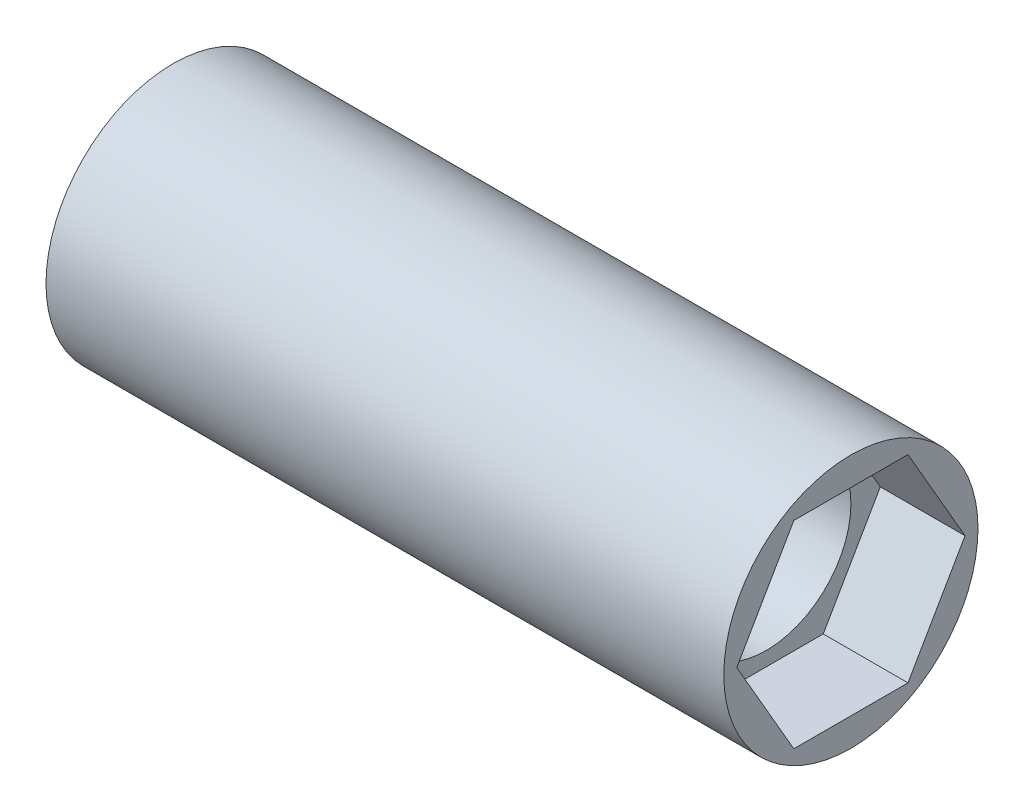
ISO-10303-21;
HEADER;
FILE_DESCRIPTION(('STEP AP214'),'2;1');
FILE_NAME('part.step','',(''),(''),'','','');
FILE_SCHEMA(('AUTOMOTIVE_DESIGN { 1 0 10303 214 1 1 1 1 }'));
ENDSEC;
DATA;
#1=APPLICATION_CONTEXT('core data for automotive mechanical design processes');
#2=APPLICATION_PROTOCOL_DEFINITION('international standard','automotive_design',2000,#1);
#3=PRODUCT_CONTEXT('',#1,'mechanical');
#4=PRODUCT('Part','Part','',(#3));
#5=PRODUCT_RELATED_PRODUCT_CATEGORY('part','',(#4));
#6=PRODUCT_DEFINITION_FORMATION('','',#4);
#7=PRODUCT_DEFINITION_CONTEXT('part definition',#1,'design');
#8=PRODUCT_DEFINITION('design','',#6,#7);
#9=PRODUCT_DEFINITION_SHAPE('','',#8);
#10=(LENGTH_UNIT() NAMED_UNIT(*) SI_UNIT(.MILLI.,.METRE.));
#11=(NAMED_UNIT(*) PLANE_ANGLE_UNIT() SI_UNIT($,.RADIAN.));
#12=(NAMED_UNIT(*) SI_UNIT($,.STERADIAN.) SOLID_ANGLE_UNIT());
#13=UNCERTAINTY_MEASURE_WITH_UNIT(LENGTH_MEASURE(1.E-05),#10,'distance_accuracy_value','');
#14=(GEOMETRIC_REPRESENTATION_CONTEXT(3) GLOBAL_UNCERTAINTY_ASSIGNED_CONTEXT((#13)) GLOBAL_UNIT_ASSIGNED_CONTEXT((#10,
#11,#12)) REPRESENTATION_CONTEXT('',''));
#15=CARTESIAN_POINT('',(0.,0.,0.));
#16=DIRECTION('',(0.,0.,1.));
#17=DIRECTION('',(1.,0.,0.));
#18=AXIS2_PLACEMENT_3D('',#15,#16,#17);
#19=CARTESIAN_POINT('',(24.,0.,0.));
#20=DIRECTION('',(-1.,0.,0.));
#21=DIRECTION('',(0.,0.,1.));
#22=AXIS2_PLACEMENT_3D('',#19,#20,#21);
#23=CYLINDRICAL_SURFACE('',#22,3.);
#24=CARTESIAN_POINT('',(0.,0.,0.));
#25=DIRECTION('',(1.,0.,0.));
#26=DIRECTION('',(0.,0.,-1.));
#27=AXIS2_PLACEMENT_3D('',#24,#25,#26);
#28=CIRCLE('',#27,3.);
#29=CARTESIAN_POINT('',(0.,0.,-3.));
#30=VERTEX_POINT('',#29);
#31=EDGE_CURVE('E146',#30,#30,#28,.T.);
#32=ORIENTED_EDGE('',*,*,#31,.F.);
#33=EDGE_LOOP('',(#32));
#34=FACE_BOUND('',#33,.T.);
#35=CARTESIAN_POINT('',(21.,0.,0.));
#36=DIRECTION('',(1.,0.,0.));
#37=DIRECTION('',(0.,0.,-1.));
#38=AXIS2_PLACEMENT_3D('',#35,#36,#37);
#39=CIRCLE('',#38,3.);
#40=CARTESIAN_POINT('',(21.,0.,-3.));
#41=VERTEX_POINT('',#40);
#42=EDGE_CURVE('E41',#41,#41,#39,.T.);
#43=ORIENTED_EDGE('',*,*,#42,.T.);
#44=EDGE_LOOP('',(#43));
#45=FACE_BOUND('',#44,.T.);
#46=ADVANCED_FACE('F37',(#34,#45),#23,.F.);
#47=CARTESIAN_POINT('',(24.,0.,0.));
#48=DIRECTION('',(1.,0.,0.));
#49=DIRECTION('',(0.,0.,-1.));
#50=AXIS2_PLACEMENT_3D('',#47,#48,#49);
#51=PLANE('',#50);
#52=DIRECTION('',(0.,0.866025403784439,-0.5));
#53=VECTOR('',#52,1.);
#54=CARTESIAN_POINT('',(24.,-3.5,-2.02072594216369));
#55=LINE('',#54,#53);
#56=CARTESIAN_POINT('',(24.,-3.5,-2.02072594216369));
#57=VERTEX_POINT('',#56);
#58=CARTESIAN_POINT('',(24.,0.,-4.04145188432738));
#59=VERTEX_POINT('',#58);
#60=EDGE_CURVE('E54',#57,#59,#55,.T.);
#61=ORIENTED_EDGE('',*,*,#60,.F.);
#62=DIRECTION('',(0.,0.,-1.));
#63=VECTOR('',#62,1.);
#64=CARTESIAN_POINT('',(24.,-3.5,2.02072594216369));
#65=LINE('',#64,#63);
#66=CARTESIAN_POINT('',(24.,-3.5,2.02072594216369));
#67=VERTEX_POINT('',#66);
#68=EDGE_CURVE('E137',#67,#57,#65,.T.);
#69=ORIENTED_EDGE('',*,*,#68,.F.);
#70=DIRECTION('',(0.,-0.866025403784439,-0.5));
#71=VECTOR('',#70,1.);
#72=CARTESIAN_POINT('',(24.,0.,4.04145188432738));
#73=LINE('',#72,#71);
#74=CARTESIAN_POINT('',(24.,0.,4.04145188432738));
#75=VERTEX_POINT('',#74);
#76=EDGE_CURVE('E135',#75,#67,#73,.T.);
#77=ORIENTED_EDGE('',*,*,#76,.F.);
#78=DIRECTION('',(0.,-0.866025403784439,0.5));
#79=VECTOR('',#78,1.);
#80=CARTESIAN_POINT('',(24.,3.5,2.02072594216369));
#81=LINE('',#80,#79);
#82=CARTESIAN_POINT('',(24.,3.5,2.02072594216369));
#83=VERTEX_POINT('',#82);
#84=EDGE_CURVE('E102',#83,#75,#81,.T.);
#85=ORIENTED_EDGE('',*,*,#84,.F.);
#86=DIRECTION('',(0.,0.,1.));
#87=VECTOR('',#86,1.);
#88=CARTESIAN_POINT('',(24.,3.5,-2.02072594216369));
#89=LINE('',#88,#87);
#90=CARTESIAN_POINT('',(24.,3.5,-2.02072594216369));
#91=VERTEX_POINT('',#90);
#92=EDGE_CURVE('E131',#91,#83,#89,.T.);
#93=ORIENTED_EDGE('',*,*,#92,.F.);
#94=DIRECTION('',(0.,0.866025403784439,0.5));
#95=VECTOR('',#94,1.);
#96=CARTESIAN_POINT('',(24.,0.,-4.04145188432738));
#97=LINE('',#96,#95);
#98=EDGE_CURVE('E128',#59,#91,#97,.T.);
#99=ORIENTED_EDGE('',*,*,#98,.F.);
#100=EDGE_LOOP('',(#61,#69,#77,#85,#93,#99));
#101=FACE_BOUND('',#100,.T.);
#102=CARTESIAN_POINT('',(24.,0.,0.));
#103=DIRECTION('',(1.,0.,0.));
#104=DIRECTION('',(0.,0.,-1.));
#105=AXIS2_PLACEMENT_3D('',#102,#103,#104);
#106=CIRCLE('',#105,4.5);
#107=CARTESIAN_POINT('',(24.,0.,-4.5));
#108=VERTEX_POINT('',#107);
#109=EDGE_CURVE('E11',#108,#108,#106,.T.);
#110=ORIENTED_EDGE('',*,*,#109,.T.);
#111=EDGE_LOOP('',(#110));
#112=FACE_BOUND('',#111,.T.);
#113=ADVANCED_FACE('F155',(#101,#112),#51,.T.);
#114=CARTESIAN_POINT('',(0.,0.,0.));
#115=DIRECTION('',(1.,0.,0.));
#116=DIRECTION('',(0.,0.,-1.));
#117=AXIS2_PLACEMENT_3D('',#114,#115,#116);
#118=PLANE('',#117);
#119=CARTESIAN_POINT('',(0.,0.,0.));
#120=DIRECTION('',(1.,0.,0.));
#121=DIRECTION('',(0.,0.,-1.));
#122=AXIS2_PLACEMENT_3D('',#119,#120,#121);
#123=CIRCLE('',#122,4.5);
#124=CARTESIAN_POINT('',(0.,0.,-4.5));
#125=VERTEX_POINT('',#124);
#126=EDGE_CURVE('E46',#125,#125,#123,.T.);
#127=ORIENTED_EDGE('',*,*,#126,.F.);
#128=EDGE_LOOP('',(#127));
#129=FACE_BOUND('',#128,.T.);
#130=ORIENTED_EDGE('',*,*,#31,.T.);
#131=EDGE_LOOP('',(#130));
#132=FACE_BOUND('',#131,.T.);
#133=ADVANCED_FACE('F152',(#129,#132),#118,.F.);
#134=CARTESIAN_POINT('',(24.,0.,0.));
#135=DIRECTION('',(-1.,0.,0.));
#136=DIRECTION('',(0.,0.,1.));
#137=AXIS2_PLACEMENT_3D('',#134,#135,#136);
#138=CYLINDRICAL_SURFACE('',#137,4.5);
#139=ORIENTED_EDGE('',*,*,#109,.F.);
#140=EDGE_LOOP('',(#139));
#141=FACE_BOUND('',#140,.T.);
#142=ORIENTED_EDGE('',*,*,#126,.T.);
#143=EDGE_LOOP('',(#142));
#144=FACE_BOUND('',#143,.T.);
#145=ADVANCED_FACE('F39',(#141,#144),#138,.T.);
#146=CARTESIAN_POINT('',(21.,-3.5,-2.02072594216369));
#147=DIRECTION('',(0.,-0.499999999999999,-0.866025403784439));
#148=DIRECTION('',(0.,0.866025403784439,-0.5));
#149=AXIS2_PLACEMENT_3D('',#146,#147,#148);
#150=PLANE('',#149);
#151=ORIENTED_EDGE('',*,*,#60,.T.);
#152=DIRECTION('',(1.,0.,0.));
#153=VECTOR('',#152,1.);
#154=CARTESIAN_POINT('',(21.,0.,-4.04145188432738));
#155=LINE('',#154,#153);
#156=CARTESIAN_POINT('',(21.,0.,-4.04145188432738));
#157=VERTEX_POINT('',#156);
#158=EDGE_CURVE('E84',#157,#59,#155,.T.);
#159=ORIENTED_EDGE('',*,*,#158,.F.);
#160=DIRECTION('',(0.,0.866025403784439,-0.5));
#161=VECTOR('',#160,1.);
#162=CARTESIAN_POINT('',(21.,-3.5,-2.02072594216369));
#163=LINE('',#162,#161);
#164=CARTESIAN_POINT('',(21.,-3.5,-2.02072594216369));
#165=VERTEX_POINT('',#164);
#166=EDGE_CURVE('E139',#165,#157,#163,.T.);
#167=ORIENTED_EDGE('',*,*,#166,.F.);
#168=DIRECTION('',(1.,0.,0.));
#169=VECTOR('',#168,1.);
#170=CARTESIAN_POINT('',(21.,-3.5,-2.02072594216369));
#171=LINE('',#170,#169);
#172=EDGE_CURVE('E62',#165,#57,#171,.T.);
#173=ORIENTED_EDGE('',*,*,#172,.T.);
#174=EDGE_LOOP('',(#151,#159,#167,#173));
#175=FACE_BOUND('',#174,.T.);
#176=ADVANCED_FACE('F177',(#175),#150,.F.);
#177=CARTESIAN_POINT('',(21.,-3.5,2.02072594216369));
#178=DIRECTION('',(0.,-1.,0.));
#179=DIRECTION('',(0.,0.,-1.));
#180=AXIS2_PLACEMENT_3D('',#177,#178,#179);
#181=PLANE('',#180);
#182=ORIENTED_EDGE('',*,*,#68,.T.);
#183=ORIENTED_EDGE('',*,*,#172,.F.);
#184=DIRECTION('',(0.,0.,-1.));
#185=VECTOR('',#184,1.);
#186=CARTESIAN_POINT('',(21.,-3.5,2.02072594216369));
#187=LINE('',#186,#185);
#188=CARTESIAN_POINT('',(21.,-3.5,2.02072594216369));
#189=VERTEX_POINT('',#188);
#190=EDGE_CURVE('E114',#189,#165,#187,.T.);
#191=ORIENTED_EDGE('',*,*,#190,.F.);
#192=DIRECTION('',(1.,0.,0.));
#193=VECTOR('',#192,1.);
#194=CARTESIAN_POINT('',(21.,-3.5,2.02072594216369));
#195=LINE('',#194,#193);
#196=EDGE_CURVE('E106',#189,#67,#195,.T.);
#197=ORIENTED_EDGE('',*,*,#196,.T.);
#198=EDGE_LOOP('',(#182,#183,#191,#197));
#199=FACE_BOUND('',#198,.T.);
#200=ADVANCED_FACE('F174',(#199),#181,.F.);
#201=CARTESIAN_POINT('',(21.,0.,4.04145188432738));
#202=DIRECTION('',(0.,-0.5,0.866025403784438));
#203=DIRECTION('',(0.,-0.866025403784439,-0.5));
#204=AXIS2_PLACEMENT_3D('',#201,#202,#203);
#205=PLANE('',#204);
#206=ORIENTED_EDGE('',*,*,#76,.T.);
#207=ORIENTED_EDGE('',*,*,#196,.F.);
#208=DIRECTION('',(0.,-0.866025403784439,-0.5));
#209=VECTOR('',#208,1.);
#210=CARTESIAN_POINT('',(21.,0.,4.04145188432738));
#211=LINE('',#210,#209);
#212=CARTESIAN_POINT('',(21.,0.,4.04145188432738));
#213=VERTEX_POINT('',#212);
#214=EDGE_CURVE('E110',#213,#189,#211,.T.);
#215=ORIENTED_EDGE('',*,*,#214,.F.);
#216=DIRECTION('',(1.,0.,0.));
#217=VECTOR('',#216,1.);
#218=CARTESIAN_POINT('',(21.,0.,4.04145188432738));
#219=LINE('',#218,#217);
#220=EDGE_CURVE('E95',#213,#75,#219,.T.);
#221=ORIENTED_EDGE('',*,*,#220,.T.);
#222=EDGE_LOOP('',(#206,#207,#215,#221));
#223=FACE_BOUND('',#222,.T.);
#224=ADVANCED_FACE('F111',(#223),#205,.F.);
#225=CARTESIAN_POINT('',(21.,3.5,2.02072594216369));
#226=DIRECTION('',(0.,0.5,0.866025403784439));
#227=DIRECTION('',(0.,-0.866025403784439,0.5));
#228=AXIS2_PLACEMENT_3D('',#225,#226,#227);
#229=PLANE('',#228);
#230=ORIENTED_EDGE('',*,*,#84,.T.);
#231=ORIENTED_EDGE('',*,*,#220,.F.);
#232=DIRECTION('',(0.,-0.866025403784439,0.5));
#233=VECTOR('',#232,1.);
#234=CARTESIAN_POINT('',(21.,3.5,2.02072594216369));
#235=LINE('',#234,#233);
#236=CARTESIAN_POINT('',(21.,3.5,2.02072594216369));
#237=VERTEX_POINT('',#236);
#238=EDGE_CURVE('E99',#237,#213,#235,.T.);
#239=ORIENTED_EDGE('',*,*,#238,.F.);
#240=DIRECTION('',(1.,0.,0.));
#241=VECTOR('',#240,1.);
#242=CARTESIAN_POINT('',(21.,3.5,2.02072594216369));
#243=LINE('',#242,#241);
#244=EDGE_CURVE('E107',#237,#83,#243,.T.);
#245=ORIENTED_EDGE('',*,*,#244,.T.);
#246=EDGE_LOOP('',(#230,#231,#239,#245));
#247=FACE_BOUND('',#246,.T.);
#248=ADVANCED_FACE('F97',(#247),#229,.F.);
#249=CARTESIAN_POINT('',(21.,3.5,-2.02072594216369));
#250=DIRECTION('',(0.,1.,0.));
#251=DIRECTION('',(0.,0.,1.));
#252=AXIS2_PLACEMENT_3D('',#249,#250,#251);
#253=PLANE('',#252);
#254=ORIENTED_EDGE('',*,*,#92,.T.);
#255=ORIENTED_EDGE('',*,*,#244,.F.);
#256=DIRECTION('',(0.,0.,1.));
#257=VECTOR('',#256,1.);
#258=CARTESIAN_POINT('',(21.,3.5,-2.02072594216369));
#259=LINE('',#258,#257);
#260=CARTESIAN_POINT('',(21.,3.5,-2.02072594216369));
#261=VERTEX_POINT('',#260);
#262=EDGE_CURVE('E120',#261,#237,#259,.T.);
#263=ORIENTED_EDGE('',*,*,#262,.F.);
#264=DIRECTION('',(1.,0.,0.));
#265=VECTOR('',#264,1.);
#266=CARTESIAN_POINT('',(21.,3.5,-2.02072594216369));
#267=LINE('',#266,#265);
#268=EDGE_CURVE('E143',#261,#91,#267,.T.);
#269=ORIENTED_EDGE('',*,*,#268,.T.);
#270=EDGE_LOOP('',(#254,#255,#263,#269));
#271=FACE_BOUND('',#270,.T.);
#272=ADVANCED_FACE('F170',(#271),#253,.F.);
#273=CARTESIAN_POINT('',(21.,0.,-4.04145188432738));
#274=DIRECTION('',(0.,0.5,-0.866025403784438));
#275=DIRECTION('',(0.,0.866025403784439,0.5));
#276=AXIS2_PLACEMENT_3D('',#273,#274,#275);
#277=PLANE('',#276);
#278=ORIENTED_EDGE('',*,*,#98,.T.);
#279=ORIENTED_EDGE('',*,*,#268,.F.);
#280=DIRECTION('',(0.,0.866025403784439,0.5));
#281=VECTOR('',#280,1.);
#282=CARTESIAN_POINT('',(21.,0.,-4.04145188432738));
#283=LINE('',#282,#281);
#284=EDGE_CURVE('E122',#157,#261,#283,.T.);
#285=ORIENTED_EDGE('',*,*,#284,.F.);
#286=ORIENTED_EDGE('',*,*,#158,.T.);
#287=EDGE_LOOP('',(#278,#279,#285,#286));
#288=FACE_BOUND('',#287,.T.);
#289=ADVANCED_FACE('F165',(#288),#277,.F.);
#290=CARTESIAN_POINT('',(21.,0.,0.));
#291=DIRECTION('',(1.,0.,0.));
#292=DIRECTION('',(0.,0.,-1.));
#293=AXIS2_PLACEMENT_3D('',#290,#291,#292);
#294=PLANE('',#293);
#295=ORIENTED_EDGE('',*,*,#42,.F.);
#296=EDGE_LOOP('',(#295));
#297=FACE_BOUND('',#296,.T.);
#298=ORIENTED_EDGE('',*,*,#166,.T.);
#299=ORIENTED_EDGE('',*,*,#284,.T.);
#300=ORIENTED_EDGE('',*,*,#262,.T.);
#301=ORIENTED_EDGE('',*,*,#238,.T.);
#302=ORIENTED_EDGE('',*,*,#214,.T.);
#303=ORIENTED_EDGE('',*,*,#190,.T.);
#304=EDGE_LOOP('',(#298,#299,#300,#301,#302,#303));
#305=FACE_BOUND('',#304,.T.);
#306=ADVANCED_FACE('F117',(#297,#305),#294,.T.);
#307=CLOSED_SHELL('',(#46,#113,#133,#145,#176,#200,#224,#248,#272,#289,#306));
#308=MANIFOLD_SOLID_BREP('B2',#307);
#309=ADVANCED_BREP_SHAPE_REPRESENTATION('',(#18,#308),#14);
#310=SHAPE_DEFINITION_REPRESENTATION(#9,#309);
ENDSEC;
END-ISO-10303-21;
